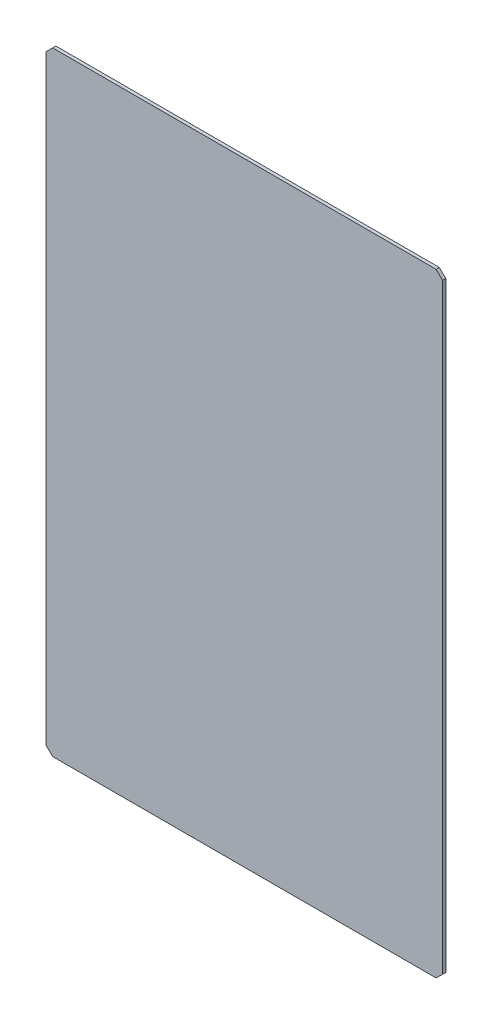
ISO-10303-21;
HEADER;
FILE_DESCRIPTION(('STEP AP214'),'2;1');
FILE_NAME('part.step','',(''),(''),'','','');
FILE_SCHEMA(('AUTOMOTIVE_DESIGN { 1 0 10303 214 1 1 1 1 }'));
ENDSEC;
DATA;
#1=APPLICATION_CONTEXT('core data for automotive mechanical design processes');
#2=APPLICATION_PROTOCOL_DEFINITION('international standard','automotive_design',2000,#1);
#3=PRODUCT_CONTEXT('',#1,'mechanical');
#4=PRODUCT('Part','Part','',(#3));
#5=PRODUCT_RELATED_PRODUCT_CATEGORY('part','',(#4));
#6=PRODUCT_DEFINITION_FORMATION('','',#4);
#7=PRODUCT_DEFINITION_CONTEXT('part definition',#1,'design');
#8=PRODUCT_DEFINITION('design','',#6,#7);
#9=PRODUCT_DEFINITION_SHAPE('','',#8);
#10=(LENGTH_UNIT() NAMED_UNIT(*) SI_UNIT(.MILLI.,.METRE.));
#11=(NAMED_UNIT(*) PLANE_ANGLE_UNIT() SI_UNIT($,.RADIAN.));
#12=(NAMED_UNIT(*) SI_UNIT($,.STERADIAN.) SOLID_ANGLE_UNIT());
#13=UNCERTAINTY_MEASURE_WITH_UNIT(LENGTH_MEASURE(1.E-05),#10,'distance_accuracy_value','');
#14=(GEOMETRIC_REPRESENTATION_CONTEXT(3) GLOBAL_UNCERTAINTY_ASSIGNED_CONTEXT((#13)) GLOBAL_UNIT_ASSIGNED_CONTEXT((#10,
#11,#12)) REPRESENTATION_CONTEXT('',''));
#15=CARTESIAN_POINT('',(0.,0.,0.));
#16=DIRECTION('',(0.,0.,1.));
#17=DIRECTION('',(1.,0.,0.));
#18=AXIS2_PLACEMENT_3D('',#15,#16,#17);
#19=CARTESIAN_POINT('',(98.425,152.4,1.5875));
#20=DIRECTION('',(-1.,0.,0.));
#21=DIRECTION('',(0.,-1.,0.));
#22=AXIS2_PLACEMENT_3D('',#19,#20,#21);
#23=PLANE('',#22);
#24=DIRECTION('',(0.,1.,0.));
#25=VECTOR('',#24,1.);
#26=CARTESIAN_POINT('',(98.425,152.4,1.5875));
#27=LINE('',#26,#25);
#28=CARTESIAN_POINT('',(98.425,-149.225,1.5875));
#29=VERTEX_POINT('',#28);
#30=CARTESIAN_POINT('',(98.425,149.225,1.5875));
#31=VERTEX_POINT('',#30);
#32=EDGE_CURVE('E125',#29,#31,#27,.T.);
#33=ORIENTED_EDGE('',*,*,#32,.F.);
#34=DIRECTION('',(0.,0.,-1.));
#35=VECTOR('',#34,1.);
#36=CARTESIAN_POINT('',(98.425,-149.225,1.5875));
#37=LINE('',#36,#35);
#38=CARTESIAN_POINT('',(98.425,-149.225,0.));
#39=VERTEX_POINT('',#38);
#40=EDGE_CURVE('E151',#29,#39,#37,.T.);
#41=ORIENTED_EDGE('',*,*,#40,.T.);
#42=DIRECTION('',(0.,1.,0.));
#43=VECTOR('',#42,1.);
#44=CARTESIAN_POINT('',(98.425,152.4,0.));
#45=LINE('',#44,#43);
#46=CARTESIAN_POINT('',(98.425,149.225,0.));
#47=VERTEX_POINT('',#46);
#48=EDGE_CURVE('E159',#39,#47,#45,.T.);
#49=ORIENTED_EDGE('',*,*,#48,.T.);
#50=DIRECTION('',(0.,0.,1.));
#51=VECTOR('',#50,1.);
#52=CARTESIAN_POINT('',(98.425,149.225,1.5875));
#53=LINE('',#52,#51);
#54=EDGE_CURVE('E149',#47,#31,#53,.T.);
#55=ORIENTED_EDGE('',*,*,#54,.T.);
#56=EDGE_LOOP('',(#33,#41,#49,#55));
#57=FACE_BOUND('',#56,.T.);
#58=ADVANCED_FACE('F34',(#57),#23,.F.);
#59=CARTESIAN_POINT('',(-98.425,152.4,1.5875));
#60=DIRECTION('',(0.,-1.,0.));
#61=DIRECTION('',(1.,0.,0.));
#62=AXIS2_PLACEMENT_3D('',#59,#60,#61);
#63=PLANE('',#62);
#64=DIRECTION('',(-1.,0.,0.));
#65=VECTOR('',#64,1.);
#66=CARTESIAN_POINT('',(-98.425,152.4,0.));
#67=LINE('',#66,#65);
#68=CARTESIAN_POINT('',(95.2499999999999,152.4,0.));
#69=VERTEX_POINT('',#68);
#70=CARTESIAN_POINT('',(-95.25,152.4,0.));
#71=VERTEX_POINT('',#70);
#72=EDGE_CURVE('E130',#69,#71,#67,.T.);
#73=ORIENTED_EDGE('',*,*,#72,.T.);
#74=DIRECTION('',(0.,0.,1.));
#75=VECTOR('',#74,1.);
#76=CARTESIAN_POINT('',(-95.25,152.4,1.5875));
#77=LINE('',#76,#75);
#78=CARTESIAN_POINT('',(-95.25,152.4,1.5875));
#79=VERTEX_POINT('',#78);
#80=EDGE_CURVE('E11',#71,#79,#77,.T.);
#81=ORIENTED_EDGE('',*,*,#80,.T.);
#82=DIRECTION('',(-1.,0.,0.));
#83=VECTOR('',#82,1.);
#84=CARTESIAN_POINT('',(-98.425,152.4,1.5875));
#85=LINE('',#84,#83);
#86=CARTESIAN_POINT('',(95.2499999999999,152.4,1.5875));
#87=VERTEX_POINT('',#86);
#88=EDGE_CURVE('E128',#87,#79,#85,.T.);
#89=ORIENTED_EDGE('',*,*,#88,.F.);
#90=DIRECTION('',(0.,0.,-1.));
#91=VECTOR('',#90,1.);
#92=CARTESIAN_POINT('',(95.2499999999999,152.4,1.5875));
#93=LINE('',#92,#91);
#94=EDGE_CURVE('E42',#87,#69,#93,.T.);
#95=ORIENTED_EDGE('',*,*,#94,.T.);
#96=EDGE_LOOP('',(#73,#81,#89,#95));
#97=FACE_BOUND('',#96,.T.);
#98=ADVANCED_FACE('F156',(#97),#63,.F.);
#99=CARTESIAN_POINT('',(-98.425,152.4,1.5875));
#100=DIRECTION('',(1.,0.,0.));
#101=DIRECTION('',(0.,1.,0.));
#102=AXIS2_PLACEMENT_3D('',#99,#100,#101);
#103=PLANE('',#102);
#104=DIRECTION('',(0.,-1.,0.));
#105=VECTOR('',#104,1.);
#106=CARTESIAN_POINT('',(-98.425,152.4,0.));
#107=LINE('',#106,#105);
#108=CARTESIAN_POINT('',(-98.425,149.225,0.));
#109=VERTEX_POINT('',#108);
#110=CARTESIAN_POINT('',(-98.425,-149.225,0.));
#111=VERTEX_POINT('',#110);
#112=EDGE_CURVE('E126',#109,#111,#107,.T.);
#113=ORIENTED_EDGE('',*,*,#112,.T.);
#114=DIRECTION('',(0.,0.,1.));
#115=VECTOR('',#114,1.);
#116=CARTESIAN_POINT('',(-98.425,-149.225,1.5875));
#117=LINE('',#116,#115);
#118=CARTESIAN_POINT('',(-98.425,-149.225,1.5875));
#119=VERTEX_POINT('',#118);
#120=EDGE_CURVE('E104',#111,#119,#117,.T.);
#121=ORIENTED_EDGE('',*,*,#120,.T.);
#122=DIRECTION('',(0.,-1.,0.));
#123=VECTOR('',#122,1.);
#124=CARTESIAN_POINT('',(-98.425,152.4,1.5875));
#125=LINE('',#124,#123);
#126=CARTESIAN_POINT('',(-98.425,149.225,1.5875));
#127=VERTEX_POINT('',#126);
#128=EDGE_CURVE('E163',#127,#119,#125,.T.);
#129=ORIENTED_EDGE('',*,*,#128,.F.);
#130=DIRECTION('',(0.,0.,-1.));
#131=VECTOR('',#130,1.);
#132=CARTESIAN_POINT('',(-98.425,149.225,1.5875));
#133=LINE('',#132,#131);
#134=EDGE_CURVE('E109',#127,#109,#133,.T.);
#135=ORIENTED_EDGE('',*,*,#134,.T.);
#136=EDGE_LOOP('',(#113,#121,#129,#135));
#137=FACE_BOUND('',#136,.T.);
#138=ADVANCED_FACE('F173',(#137),#103,.F.);
#139=CARTESIAN_POINT('',(-98.425,-152.4,1.5875));
#140=DIRECTION('',(0.,1.,0.));
#141=DIRECTION('',(0.,0.,1.));
#142=AXIS2_PLACEMENT_3D('',#139,#140,#141);
#143=PLANE('',#142);
#144=DIRECTION('',(1.,0.,0.));
#145=VECTOR('',#144,1.);
#146=CARTESIAN_POINT('',(-98.425,-152.4,1.5875));
#147=LINE('',#146,#145);
#148=CARTESIAN_POINT('',(-95.25,-152.4,1.5875));
#149=VERTEX_POINT('',#148);
#150=CARTESIAN_POINT('',(95.2500000000001,-152.4,1.5875));
#151=VERTEX_POINT('',#150);
#152=EDGE_CURVE('E119',#149,#151,#147,.T.);
#153=ORIENTED_EDGE('',*,*,#152,.F.);
#154=DIRECTION('',(0.,0.,-1.));
#155=VECTOR('',#154,1.);
#156=CARTESIAN_POINT('',(-95.25,-152.4,1.5875));
#157=LINE('',#156,#155);
#158=CARTESIAN_POINT('',(-95.25,-152.4,0.));
#159=VERTEX_POINT('',#158);
#160=EDGE_CURVE('E103',#149,#159,#157,.T.);
#161=ORIENTED_EDGE('',*,*,#160,.T.);
#162=DIRECTION('',(1.,0.,0.));
#163=VECTOR('',#162,1.);
#164=CARTESIAN_POINT('',(-98.425,-152.4,0.));
#165=LINE('',#164,#163);
#166=CARTESIAN_POINT('',(95.2500000000001,-152.4,0.));
#167=VERTEX_POINT('',#166);
#168=EDGE_CURVE('E116',#159,#167,#165,.T.);
#169=ORIENTED_EDGE('',*,*,#168,.T.);
#170=DIRECTION('',(0.,0.,1.));
#171=VECTOR('',#170,1.);
#172=CARTESIAN_POINT('',(95.2500000000001,-152.4,1.5875));
#173=LINE('',#172,#171);
#174=EDGE_CURVE('E121',#167,#151,#173,.T.);
#175=ORIENTED_EDGE('',*,*,#174,.T.);
#176=EDGE_LOOP('',(#153,#161,#169,#175));
#177=FACE_BOUND('',#176,.T.);
#178=ADVANCED_FACE('F115',(#177),#143,.F.);
#179=CARTESIAN_POINT('',(0.,0.,1.5875));
#180=DIRECTION('',(0.,0.,1.));
#181=DIRECTION('',(1.,0.,0.));
#182=AXIS2_PLACEMENT_3D('',#179,#180,#181);
#183=PLANE('',#182);
#184=ORIENTED_EDGE('',*,*,#128,.T.);
#185=DIRECTION('',(-0.707106781186544,0.707106781186551,0.));
#186=VECTOR('',#185,1.);
#187=CARTESIAN_POINT('',(-123.825,-123.824999999999,1.5875));
#188=LINE('',#187,#186);
#189=EDGE_CURVE('E147',#119,#149,#188,.F.);
#190=ORIENTED_EDGE('',*,*,#189,.T.);
#191=ORIENTED_EDGE('',*,*,#152,.T.);
#192=DIRECTION('',(-0.707106781186541,-0.707106781186554,0.));
#193=VECTOR('',#192,1.);
#194=CARTESIAN_POINT('',(123.825000000001,-123.824999999999,1.5875));
#195=LINE('',#194,#193);
#196=EDGE_CURVE('E145',#151,#29,#195,.F.);
#197=ORIENTED_EDGE('',*,*,#196,.T.);
#198=ORIENTED_EDGE('',*,*,#32,.T.);
#199=DIRECTION('',(0.707106781186543,-0.707106781186552,0.));
#200=VECTOR('',#199,1.);
#201=CARTESIAN_POINT('',(123.825000000001,123.824999999999,1.5875));
#202=LINE('',#201,#200);
#203=EDGE_CURVE('E54',#31,#87,#202,.F.);
#204=ORIENTED_EDGE('',*,*,#203,.T.);
#205=ORIENTED_EDGE('',*,*,#88,.T.);
#206=DIRECTION('',(0.707106781186541,0.707106781186554,0.));
#207=VECTOR('',#206,1.);
#208=CARTESIAN_POINT('',(-123.825000000001,123.824999999999,1.5875));
#209=LINE('',#208,#207);
#210=EDGE_CURVE('E143',#79,#127,#209,.F.);
#211=ORIENTED_EDGE('',*,*,#210,.T.);
#212=EDGE_LOOP('',(#184,#190,#191,#197,#198,#204,#205,#211));
#213=FACE_BOUND('',#212,.T.);
#214=ADVANCED_FACE('F167',(#213),#183,.T.);
#215=CARTESIAN_POINT('',(0.,0.,0.));
#216=DIRECTION('',(0.,0.,1.));
#217=DIRECTION('',(1.,0.,0.));
#218=AXIS2_PLACEMENT_3D('',#215,#216,#217);
#219=PLANE('',#218);
#220=ORIENTED_EDGE('',*,*,#168,.F.);
#221=DIRECTION('',(0.707106781186544,-0.707106781186551,0.));
#222=VECTOR('',#221,1.);
#223=CARTESIAN_POINT('',(-95.25,-152.4,0.));
#224=LINE('',#223,#222);
#225=EDGE_CURVE('E99',#159,#111,#224,.F.);
#226=ORIENTED_EDGE('',*,*,#225,.T.);
#227=ORIENTED_EDGE('',*,*,#112,.F.);
#228=DIRECTION('',(-0.707106781186541,-0.707106781186554,0.));
#229=VECTOR('',#228,1.);
#230=CARTESIAN_POINT('',(-98.425,149.225,0.));
#231=LINE('',#230,#229);
#232=EDGE_CURVE('E136',#109,#71,#231,.F.);
#233=ORIENTED_EDGE('',*,*,#232,.T.);
#234=ORIENTED_EDGE('',*,*,#72,.F.);
#235=DIRECTION('',(-0.707106781186543,0.707106781186552,0.));
#236=VECTOR('',#235,1.);
#237=CARTESIAN_POINT('',(95.2499999999999,152.4,0.));
#238=LINE('',#237,#236);
#239=EDGE_CURVE('E120',#69,#47,#238,.F.);
#240=ORIENTED_EDGE('',*,*,#239,.T.);
#241=ORIENTED_EDGE('',*,*,#48,.F.);
#242=DIRECTION('',(0.707106781186541,0.707106781186554,0.));
#243=VECTOR('',#242,1.);
#244=CARTESIAN_POINT('',(98.425,-149.225,0.));
#245=LINE('',#244,#243);
#246=EDGE_CURVE('E110',#39,#167,#245,.F.);
#247=ORIENTED_EDGE('',*,*,#246,.T.);
#248=EDGE_LOOP('',(#220,#226,#227,#233,#234,#240,#241,#247));
#249=FACE_BOUND('',#248,.T.);
#250=ADVANCED_FACE('F123',(#249),#219,.F.);
#251=CARTESIAN_POINT('',(-95.25,-152.4,1.5875));
#252=DIRECTION('',(0.707106781186551,0.707106781186544,0.));
#253=DIRECTION('',(0.,0.,-1.));
#254=AXIS2_PLACEMENT_3D('',#251,#252,#253);
#255=PLANE('',#254);
#256=ORIENTED_EDGE('',*,*,#189,.F.);
#257=ORIENTED_EDGE('',*,*,#120,.F.);
#258=ORIENTED_EDGE('',*,*,#225,.F.);
#259=ORIENTED_EDGE('',*,*,#160,.F.);
#260=EDGE_LOOP('',(#256,#257,#258,#259));
#261=FACE_BOUND('',#260,.T.);
#262=ADVANCED_FACE('F102',(#261),#255,.F.);
#263=CARTESIAN_POINT('',(98.425,-149.225,1.5875));
#264=DIRECTION('',(-0.707106781186554,0.707106781186541,0.));
#265=DIRECTION('',(0.,0.,-1.));
#266=AXIS2_PLACEMENT_3D('',#263,#264,#265);
#267=PLANE('',#266);
#268=ORIENTED_EDGE('',*,*,#196,.F.);
#269=ORIENTED_EDGE('',*,*,#174,.F.);
#270=ORIENTED_EDGE('',*,*,#246,.F.);
#271=ORIENTED_EDGE('',*,*,#40,.F.);
#272=EDGE_LOOP('',(#268,#269,#270,#271));
#273=FACE_BOUND('',#272,.T.);
#274=ADVANCED_FACE('F178',(#273),#267,.F.);
#275=CARTESIAN_POINT('',(-98.425,149.225,1.5875));
#276=DIRECTION('',(0.707106781186554,-0.707106781186541,0.));
#277=DIRECTION('',(0.,0.,-1.));
#278=AXIS2_PLACEMENT_3D('',#275,#276,#277);
#279=PLANE('',#278);
#280=ORIENTED_EDGE('',*,*,#210,.F.);
#281=ORIENTED_EDGE('',*,*,#80,.F.);
#282=ORIENTED_EDGE('',*,*,#232,.F.);
#283=ORIENTED_EDGE('',*,*,#134,.F.);
#284=EDGE_LOOP('',(#280,#281,#282,#283));
#285=FACE_BOUND('',#284,.T.);
#286=ADVANCED_FACE('F171',(#285),#279,.F.);
#287=CARTESIAN_POINT('',(95.2499999999999,152.4,1.5875));
#288=DIRECTION('',(-0.707106781186552,-0.707106781186543,0.));
#289=DIRECTION('',(0.,0.,-1.));
#290=AXIS2_PLACEMENT_3D('',#287,#288,#289);
#291=PLANE('',#290);
#292=ORIENTED_EDGE('',*,*,#203,.F.);
#293=ORIENTED_EDGE('',*,*,#54,.F.);
#294=ORIENTED_EDGE('',*,*,#239,.F.);
#295=ORIENTED_EDGE('',*,*,#94,.F.);
#296=EDGE_LOOP('',(#292,#293,#294,#295));
#297=FACE_BOUND('',#296,.T.);
#298=ADVANCED_FACE('F36',(#297),#291,.F.);
#299=CLOSED_SHELL('',(#58,#98,#138,#178,#214,#250,#262,#274,#286,#298));
#300=MANIFOLD_SOLID_BREP('B2',#299);
#301=ADVANCED_BREP_SHAPE_REPRESENTATION('',(#18,#300),#14);
#302=SHAPE_DEFINITION_REPRESENTATION(#9,#301);
ENDSEC;
END-ISO-10303-21;
